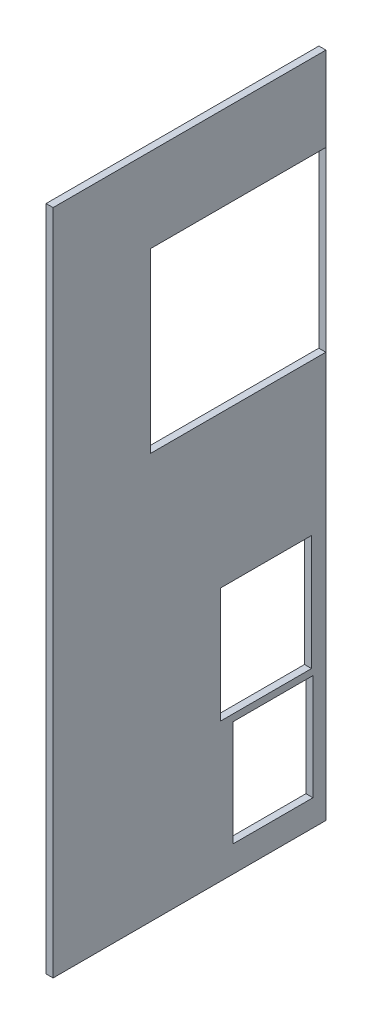
ISO-10303-21;
HEADER;
FILE_DESCRIPTION(('STEP AP214'),'2;1');
FILE_NAME('part.step','',(''),(''),'','','');
FILE_SCHEMA(('AUTOMOTIVE_DESIGN { 1 0 10303 214 1 1 1 1 }'));
ENDSEC;
DATA;
#1=APPLICATION_CONTEXT('core data for automotive mechanical design processes');
#2=APPLICATION_PROTOCOL_DEFINITION('international standard','automotive_design',2000,#1);
#3=PRODUCT_CONTEXT('',#1,'mechanical');
#4=PRODUCT('Part','Part','',(#3));
#5=PRODUCT_RELATED_PRODUCT_CATEGORY('part','',(#4));
#6=PRODUCT_DEFINITION_FORMATION('','',#4);
#7=PRODUCT_DEFINITION_CONTEXT('part definition',#1,'design');
#8=PRODUCT_DEFINITION('design','',#6,#7);
#9=PRODUCT_DEFINITION_SHAPE('','',#8);
#10=(LENGTH_UNIT() NAMED_UNIT(*) SI_UNIT(.MILLI.,.METRE.));
#11=(NAMED_UNIT(*) PLANE_ANGLE_UNIT() SI_UNIT($,.RADIAN.));
#12=(NAMED_UNIT(*) SI_UNIT($,.STERADIAN.) SOLID_ANGLE_UNIT());
#13=UNCERTAINTY_MEASURE_WITH_UNIT(LENGTH_MEASURE(1.E-05),#10,'distance_accuracy_value','');
#14=(GEOMETRIC_REPRESENTATION_CONTEXT(3) GLOBAL_UNCERTAINTY_ASSIGNED_CONTEXT((#13)) GLOBAL_UNIT_ASSIGNED_CONTEXT((#10,
#11,#12)) REPRESENTATION_CONTEXT('',''));
#15=CARTESIAN_POINT('',(0.,0.,0.));
#16=DIRECTION('',(0.,0.,1.));
#17=DIRECTION('',(1.,0.,0.));
#18=AXIS2_PLACEMENT_3D('',#15,#16,#17);
#19=CARTESIAN_POINT('',(1.5,5.85000000000011,3.40000000000003));
#20=DIRECTION('',(0.,-1.,0.));
#21=DIRECTION('',(0.,0.,-1.));
#22=AXIS2_PLACEMENT_3D('',#19,#20,#21);
#23=PLANE('',#22);
#24=DIRECTION('',(0.,0.,1.));
#25=VECTOR('',#24,1.);
#26=CARTESIAN_POINT('',(0.5,5.85000000000011,3.40000000000003));
#27=LINE('',#26,#25);
#28=CARTESIAN_POINT('',(0.5,5.85000000000011,3.40000000000003));
#29=VERTEX_POINT('',#28);
#30=CARTESIAN_POINT('',(0.5,5.85000000000012,42.25));
#31=VERTEX_POINT('',#30);
#32=EDGE_CURVE('E247',#29,#31,#27,.T.);
#33=ORIENTED_EDGE('',*,*,#32,.F.);
#34=DIRECTION('',(-1.,0.,0.));
#35=VECTOR('',#34,1.);
#36=CARTESIAN_POINT('',(1.5,5.85000000000011,3.40000000000003));
#37=LINE('',#36,#35);
#38=CARTESIAN_POINT('',(1.5,5.85000000000011,3.40000000000003));
#39=VERTEX_POINT('',#38);
#40=EDGE_CURVE('E11',#39,#29,#37,.T.);
#41=ORIENTED_EDGE('',*,*,#40,.F.);
#42=DIRECTION('',(0.,0.,1.));
#43=VECTOR('',#42,1.);
#44=CARTESIAN_POINT('',(1.5,5.85000000000011,3.40000000000003));
#45=LINE('',#44,#43);
#46=CARTESIAN_POINT('',(1.5,5.85000000000012,42.25));
#47=VERTEX_POINT('',#46);
#48=EDGE_CURVE('E248',#39,#47,#45,.T.);
#49=ORIENTED_EDGE('',*,*,#48,.T.);
#50=DIRECTION('',(-1.,0.,0.));
#51=VECTOR('',#50,1.);
#52=CARTESIAN_POINT('',(1.5,5.85000000000012,42.25));
#53=LINE('',#52,#51);
#54=EDGE_CURVE('E35',#47,#31,#53,.T.);
#55=ORIENTED_EDGE('',*,*,#54,.T.);
#56=EDGE_LOOP('',(#33,#41,#49,#55));
#57=FACE_BOUND('',#56,.T.);
#58=ADVANCED_FACE('F32',(#57),#23,.T.);
#59=CARTESIAN_POINT('',(1.5,100.85,3.40000000000002));
#60=DIRECTION('',(0.,0.,-1.));
#61=DIRECTION('',(0.,1.,0.));
#62=AXIS2_PLACEMENT_3D('',#59,#60,#61);
#63=PLANE('',#62);
#64=DIRECTION('',(0.,-1.,0.));
#65=VECTOR('',#64,1.);
#66=CARTESIAN_POINT('',(0.5,100.85,3.40000000000002));
#67=LINE('',#66,#65);
#68=CARTESIAN_POINT('',(0.5,100.85,3.40000000000002));
#69=VERTEX_POINT('',#68);
#70=EDGE_CURVE('E252',#69,#29,#67,.T.);
#71=ORIENTED_EDGE('',*,*,#70,.F.);
#72=DIRECTION('',(-1.,0.,0.));
#73=VECTOR('',#72,1.);
#74=CARTESIAN_POINT('',(1.5,100.85,3.40000000000002));
#75=LINE('',#74,#73);
#76=CARTESIAN_POINT('',(1.5,100.85,3.40000000000002));
#77=VERTEX_POINT('',#76);
#78=EDGE_CURVE('E40',#77,#69,#75,.T.);
#79=ORIENTED_EDGE('',*,*,#78,.F.);
#80=DIRECTION('',(0.,-1.,0.));
#81=VECTOR('',#80,1.);
#82=CARTESIAN_POINT('',(1.5,100.85,3.40000000000002));
#83=LINE('',#82,#81);
#84=EDGE_CURVE('E258',#77,#39,#83,.T.);
#85=ORIENTED_EDGE('',*,*,#84,.T.);
#86=ORIENTED_EDGE('',*,*,#40,.T.);
#87=EDGE_LOOP('',(#71,#79,#85,#86));
#88=FACE_BOUND('',#87,.T.);
#89=ADVANCED_FACE('F283',(#88),#63,.T.);
#90=CARTESIAN_POINT('',(1.5,100.85,42.25));
#91=DIRECTION('',(0.,1.,0.));
#92=DIRECTION('',(0.,0.,1.));
#93=AXIS2_PLACEMENT_3D('',#90,#91,#92);
#94=PLANE('',#93);
#95=DIRECTION('',(0.,0.,-1.));
#96=VECTOR('',#95,1.);
#97=CARTESIAN_POINT('',(0.5,100.85,42.25));
#98=LINE('',#97,#96);
#99=CARTESIAN_POINT('',(0.5,100.85,42.25));
#100=VERTEX_POINT('',#99);
#101=EDGE_CURVE('E266',#100,#69,#98,.T.);
#102=ORIENTED_EDGE('',*,*,#101,.F.);
#103=DIRECTION('',(-1.,0.,0.));
#104=VECTOR('',#103,1.);
#105=CARTESIAN_POINT('',(1.5,100.85,42.25));
#106=LINE('',#105,#104);
#107=CARTESIAN_POINT('',(1.5,100.85,42.25));
#108=VERTEX_POINT('',#107);
#109=EDGE_CURVE('E271',#108,#100,#106,.T.);
#110=ORIENTED_EDGE('',*,*,#109,.F.);
#111=DIRECTION('',(0.,0.,-1.));
#112=VECTOR('',#111,1.);
#113=CARTESIAN_POINT('',(1.5,100.85,42.25));
#114=LINE('',#113,#112);
#115=EDGE_CURVE('E255',#108,#77,#114,.T.);
#116=ORIENTED_EDGE('',*,*,#115,.T.);
#117=ORIENTED_EDGE('',*,*,#78,.T.);
#118=EDGE_LOOP('',(#102,#110,#116,#117));
#119=FACE_BOUND('',#118,.T.);
#120=ADVANCED_FACE('F289',(#119),#94,.T.);
#121=CARTESIAN_POINT('',(1.5,5.85000000000012,42.25));
#122=DIRECTION('',(0.,0.,1.));
#123=DIRECTION('',(0.,-1.,0.));
#124=AXIS2_PLACEMENT_3D('',#121,#122,#123);
#125=PLANE('',#124);
#126=DIRECTION('',(0.,1.,0.));
#127=VECTOR('',#126,1.);
#128=CARTESIAN_POINT('',(0.5,5.85000000000012,42.25));
#129=LINE('',#128,#127);
#130=EDGE_CURVE('E263',#31,#100,#129,.T.);
#131=ORIENTED_EDGE('',*,*,#130,.F.);
#132=ORIENTED_EDGE('',*,*,#54,.F.);
#133=DIRECTION('',(0.,1.,0.));
#134=VECTOR('',#133,1.);
#135=CARTESIAN_POINT('',(1.5,5.85000000000012,42.25));
#136=LINE('',#135,#134);
#137=EDGE_CURVE('E251',#47,#108,#136,.T.);
#138=ORIENTED_EDGE('',*,*,#137,.T.);
#139=ORIENTED_EDGE('',*,*,#109,.T.);
#140=EDGE_LOOP('',(#131,#132,#138,#139));
#141=FACE_BOUND('',#140,.T.);
#142=ADVANCED_FACE('F279',(#141),#125,.T.);
#143=CARTESIAN_POINT('',(1.5,0.,0.));
#144=DIRECTION('',(-1.,0.,0.));
#145=DIRECTION('',(0.,0.,1.));
#146=AXIS2_PLACEMENT_3D('',#143,#144,#145);
#147=PLANE('',#146);
#148=DIRECTION('',(0.,0.,-1.));
#149=VECTOR('',#148,1.);
#150=CARTESIAN_POINT('',(1.5,24.638135831115,0.));
#151=LINE('',#150,#149);
#152=CARTESIAN_POINT('',(1.5,24.638135831115,16.65));
#153=VERTEX_POINT('',#152);
#154=CARTESIAN_POINT('',(1.5,24.638135831115,5.25000000000004));
#155=VERTEX_POINT('',#154);
#156=EDGE_CURVE('E241',#153,#155,#151,.T.);
#157=ORIENTED_EDGE('',*,*,#156,.T.);
#158=DIRECTION('',(0.,-1.,0.));
#159=VECTOR('',#158,1.);
#160=CARTESIAN_POINT('',(1.5,0.,5.25000000000004));
#161=LINE('',#160,#159);
#162=CARTESIAN_POINT('',(1.5,9.57813583111501,5.25000000000004));
#163=VERTEX_POINT('',#162);
#164=EDGE_CURVE('E244',#155,#163,#161,.T.);
#165=ORIENTED_EDGE('',*,*,#164,.T.);
#166=DIRECTION('',(0.,0.,1.));
#167=VECTOR('',#166,1.);
#168=CARTESIAN_POINT('',(1.5,9.57813583111501,0.));
#169=LINE('',#168,#167);
#170=CARTESIAN_POINT('',(1.5,9.57813583111501,16.65));
#171=VERTEX_POINT('',#170);
#172=EDGE_CURVE('E238',#163,#171,#169,.T.);
#173=ORIENTED_EDGE('',*,*,#172,.T.);
#174=DIRECTION('',(0.,1.,0.));
#175=VECTOR('',#174,1.);
#176=CARTESIAN_POINT('',(1.5,0.,16.65));
#177=LINE('',#176,#175);
#178=EDGE_CURVE('E150',#171,#153,#177,.T.);
#179=ORIENTED_EDGE('',*,*,#178,.T.);
#180=EDGE_LOOP('',(#157,#165,#173,#179));
#181=FACE_BOUND('',#180,.T.);
#182=DIRECTION('',(0.,0.,-1.));
#183=VECTOR('',#182,1.);
#184=CARTESIAN_POINT('',(1.5,88.85,0.));
#185=LINE('',#184,#183);
#186=CARTESIAN_POINT('',(1.5,88.85,28.4));
#187=VERTEX_POINT('',#186);
#188=CARTESIAN_POINT('',(1.5,88.85,3.41328504716969));
#189=VERTEX_POINT('',#188);
#190=EDGE_CURVE('E232',#187,#189,#185,.T.);
#191=ORIENTED_EDGE('',*,*,#190,.T.);
#192=DIRECTION('',(0.,-1.,0.));
#193=VECTOR('',#192,1.);
#194=CARTESIAN_POINT('',(1.5,0.,3.41328504716969));
#195=LINE('',#194,#193);
#196=CARTESIAN_POINT('',(1.5,63.6,3.41328504716969));
#197=VERTEX_POINT('',#196);
#198=EDGE_CURVE('E235',#189,#197,#195,.T.);
#199=ORIENTED_EDGE('',*,*,#198,.T.);
#200=DIRECTION('',(0.,0.,1.));
#201=VECTOR('',#200,1.);
#202=CARTESIAN_POINT('',(1.5,63.6,0.));
#203=LINE('',#202,#201);
#204=CARTESIAN_POINT('',(1.5,63.6,28.4));
#205=VERTEX_POINT('',#204);
#206=EDGE_CURVE('E226',#197,#205,#203,.T.);
#207=ORIENTED_EDGE('',*,*,#206,.T.);
#208=DIRECTION('',(0.,1.,0.));
#209=VECTOR('',#208,1.);
#210=CARTESIAN_POINT('',(1.5,0.,28.4));
#211=LINE('',#210,#209);
#212=EDGE_CURVE('E229',#205,#187,#211,.T.);
#213=ORIENTED_EDGE('',*,*,#212,.T.);
#214=EDGE_LOOP('',(#191,#199,#207,#213));
#215=FACE_BOUND('',#214,.T.);
#216=DIRECTION('',(0.,0.,-1.));
#217=VECTOR('',#216,1.);
#218=CARTESIAN_POINT('',(1.5,42.0175613536461,0.));
#219=LINE('',#218,#217);
#220=CARTESIAN_POINT('',(1.5,42.0175613536461,18.4326));
#221=VERTEX_POINT('',#220);
#222=CARTESIAN_POINT('',(1.5,42.0175613536461,5.4557399975515));
#223=VERTEX_POINT('',#222);
#224=EDGE_CURVE('E220',#221,#223,#219,.T.);
#225=ORIENTED_EDGE('',*,*,#224,.T.);
#226=DIRECTION('',(0.,-1.,0.));
#227=VECTOR('',#226,1.);
#228=CARTESIAN_POINT('',(1.5,0.,5.4557399975515));
#229=LINE('',#228,#227);
#230=CARTESIAN_POINT('',(1.5,25.6091613536461,5.4557399975515));
#231=VERTEX_POINT('',#230);
#232=EDGE_CURVE('E223',#223,#231,#229,.T.);
#233=ORIENTED_EDGE('',*,*,#232,.T.);
#234=DIRECTION('',(0.,0.,1.));
#235=VECTOR('',#234,1.);
#236=CARTESIAN_POINT('',(1.5,25.6091613536461,0.));
#237=LINE('',#236,#235);
#238=CARTESIAN_POINT('',(1.5,25.6091613536461,18.4326));
#239=VERTEX_POINT('',#238);
#240=EDGE_CURVE('E174',#231,#239,#237,.T.);
#241=ORIENTED_EDGE('',*,*,#240,.T.);
#242=DIRECTION('',(0.,1.,0.));
#243=VECTOR('',#242,1.);
#244=CARTESIAN_POINT('',(1.5,0.,18.4326));
#245=LINE('',#244,#243);
#246=EDGE_CURVE('E217',#239,#221,#245,.T.);
#247=ORIENTED_EDGE('',*,*,#246,.T.);
#248=EDGE_LOOP('',(#225,#233,#241,#247));
#249=FACE_BOUND('',#248,.T.);
#250=ORIENTED_EDGE('',*,*,#48,.F.);
#251=ORIENTED_EDGE('',*,*,#84,.F.);
#252=ORIENTED_EDGE('',*,*,#115,.F.);
#253=ORIENTED_EDGE('',*,*,#137,.F.);
#254=EDGE_LOOP('',(#250,#251,#252,#253));
#255=FACE_BOUND('',#254,.T.);
#256=ADVANCED_FACE('F286',(#181,#215,#249,#255),#147,.F.);
#257=CARTESIAN_POINT('',(0.5,0.,0.));
#258=DIRECTION('',(-1.,0.,0.));
#259=DIRECTION('',(0.,0.,1.));
#260=AXIS2_PLACEMENT_3D('',#257,#258,#259);
#261=PLANE('',#260);
#262=DIRECTION('',(0.,-1.,0.));
#263=VECTOR('',#262,1.);
#264=CARTESIAN_POINT('',(0.5,9.57813583111501,5.25000000000004));
#265=LINE('',#264,#263);
#266=CARTESIAN_POINT('',(0.5,24.638135831115,5.25000000000004));
#267=VERTEX_POINT('',#266);
#268=CARTESIAN_POINT('',(0.5,9.57813583111501,5.25000000000004));
#269=VERTEX_POINT('',#268);
#270=EDGE_CURVE('E162',#267,#269,#265,.T.);
#271=ORIENTED_EDGE('',*,*,#270,.F.);
#272=DIRECTION('',(0.,0.,-1.));
#273=VECTOR('',#272,1.);
#274=CARTESIAN_POINT('',(0.5,24.638135831115,5.25000000000004));
#275=LINE('',#274,#273);
#276=CARTESIAN_POINT('',(0.5,24.638135831115,16.65));
#277=VERTEX_POINT('',#276);
#278=EDGE_CURVE('E167',#277,#267,#275,.T.);
#279=ORIENTED_EDGE('',*,*,#278,.F.);
#280=DIRECTION('',(0.,1.,0.));
#281=VECTOR('',#280,1.);
#282=CARTESIAN_POINT('',(0.5,9.57813583111501,16.65));
#283=LINE('',#282,#281);
#284=CARTESIAN_POINT('',(0.5,9.57813583111501,16.65));
#285=VERTEX_POINT('',#284);
#286=EDGE_CURVE('E147',#285,#277,#283,.T.);
#287=ORIENTED_EDGE('',*,*,#286,.F.);
#288=DIRECTION('',(0.,0.,1.));
#289=VECTOR('',#288,1.);
#290=CARTESIAN_POINT('',(0.5,9.57813583111501,5.25000000000004));
#291=LINE('',#290,#289);
#292=EDGE_CURVE('E157',#269,#285,#291,.T.);
#293=ORIENTED_EDGE('',*,*,#292,.F.);
#294=EDGE_LOOP('',(#271,#279,#287,#293));
#295=FACE_BOUND('',#294,.T.);
#296=DIRECTION('',(0.,-1.,0.));
#297=VECTOR('',#296,1.);
#298=CARTESIAN_POINT('',(0.5,63.6,3.41328504716969));
#299=LINE('',#298,#297);
#300=CARTESIAN_POINT('',(0.5,88.85,3.41328504716969));
#301=VERTEX_POINT('',#300);
#302=CARTESIAN_POINT('',(0.5,63.6,3.41328504716969));
#303=VERTEX_POINT('',#302);
#304=EDGE_CURVE('E177',#301,#303,#299,.T.);
#305=ORIENTED_EDGE('',*,*,#304,.F.);
#306=DIRECTION('',(0.,0.,-1.));
#307=VECTOR('',#306,1.);
#308=CARTESIAN_POINT('',(0.5,88.85,3.41328504716969));
#309=LINE('',#308,#307);
#310=CARTESIAN_POINT('',(0.5,88.85,28.4));
#311=VERTEX_POINT('',#310);
#312=EDGE_CURVE('E185',#311,#301,#309,.T.);
#313=ORIENTED_EDGE('',*,*,#312,.F.);
#314=DIRECTION('',(0.,1.,0.));
#315=VECTOR('',#314,1.);
#316=CARTESIAN_POINT('',(0.5,63.6,28.4));
#317=LINE('',#316,#315);
#318=CARTESIAN_POINT('',(0.5,63.6,28.4));
#319=VERTEX_POINT('',#318);
#320=EDGE_CURVE('E182',#319,#311,#317,.T.);
#321=ORIENTED_EDGE('',*,*,#320,.F.);
#322=DIRECTION('',(0.,0.,1.));
#323=VECTOR('',#322,1.);
#324=CARTESIAN_POINT('',(0.5,63.6,3.41328504716969));
#325=LINE('',#324,#323);
#326=EDGE_CURVE('E179',#303,#319,#325,.T.);
#327=ORIENTED_EDGE('',*,*,#326,.F.);
#328=EDGE_LOOP('',(#305,#313,#321,#327));
#329=FACE_BOUND('',#328,.T.);
#330=DIRECTION('',(0.,-1.,0.));
#331=VECTOR('',#330,1.);
#332=CARTESIAN_POINT('',(0.5,42.0175613536461,5.4557399975515));
#333=LINE('',#332,#331);
#334=CARTESIAN_POINT('',(0.5,42.0175613536461,5.4557399975515));
#335=VERTEX_POINT('',#334);
#336=CARTESIAN_POINT('',(0.5,25.6091613536461,5.4557399975515));
#337=VERTEX_POINT('',#336);
#338=EDGE_CURVE('E196',#335,#337,#333,.T.);
#339=ORIENTED_EDGE('',*,*,#338,.F.);
#340=DIRECTION('',(0.,0.,-1.));
#341=VECTOR('',#340,1.);
#342=CARTESIAN_POINT('',(0.5,42.0175613536461,5.4557399975515));
#343=LINE('',#342,#341);
#344=CARTESIAN_POINT('',(0.5,42.0175613536461,18.4326));
#345=VERTEX_POINT('',#344);
#346=EDGE_CURVE('E204',#345,#335,#343,.T.);
#347=ORIENTED_EDGE('',*,*,#346,.F.);
#348=DIRECTION('',(0.,1.,0.));
#349=VECTOR('',#348,1.);
#350=CARTESIAN_POINT('',(0.5,42.0175613536461,18.4326));
#351=LINE('',#350,#349);
#352=CARTESIAN_POINT('',(0.5,25.6091613536461,18.4326));
#353=VERTEX_POINT('',#352);
#354=EDGE_CURVE('E201',#353,#345,#351,.T.);
#355=ORIENTED_EDGE('',*,*,#354,.F.);
#356=DIRECTION('',(0.,0.,1.));
#357=VECTOR('',#356,1.);
#358=CARTESIAN_POINT('',(0.5,25.6091613536461,5.4557399975515));
#359=LINE('',#358,#357);
#360=EDGE_CURVE('E198',#337,#353,#359,.T.);
#361=ORIENTED_EDGE('',*,*,#360,.F.);
#362=EDGE_LOOP('',(#339,#347,#355,#361));
#363=FACE_BOUND('',#362,.T.);
#364=ORIENTED_EDGE('',*,*,#32,.T.);
#365=ORIENTED_EDGE('',*,*,#130,.T.);
#366=ORIENTED_EDGE('',*,*,#101,.T.);
#367=ORIENTED_EDGE('',*,*,#70,.T.);
#368=EDGE_LOOP('',(#364,#365,#366,#367));
#369=FACE_BOUND('',#368,.T.);
#370=ADVANCED_FACE('F164',(#295,#329,#363,#369),#261,.T.);
#371=CARTESIAN_POINT('',(10.5,42.0175613536461,5.4557399975515));
#372=DIRECTION('',(0.,0.,-1.));
#373=DIRECTION('',(-1.,0.,0.));
#374=AXIS2_PLACEMENT_3D('',#371,#372,#373);
#375=PLANE('',#374);
#376=DIRECTION('',(-1.,0.,0.));
#377=VECTOR('',#376,1.);
#378=CARTESIAN_POINT('',(10.5,42.0175613536461,5.4557399975515));
#379=LINE('',#378,#377);
#380=EDGE_CURVE('E180',#223,#335,#379,.T.);
#381=ORIENTED_EDGE('',*,*,#380,.T.);
#382=ORIENTED_EDGE('',*,*,#338,.T.);
#383=DIRECTION('',(-1.,0.,0.));
#384=VECTOR('',#383,1.);
#385=CARTESIAN_POINT('',(10.5,25.6091613536461,5.4557399975515));
#386=LINE('',#385,#384);
#387=EDGE_CURVE('E207',#231,#337,#386,.T.);
#388=ORIENTED_EDGE('',*,*,#387,.F.);
#389=ORIENTED_EDGE('',*,*,#232,.F.);
#390=EDGE_LOOP('',(#381,#382,#388,#389));
#391=FACE_BOUND('',#390,.T.);
#392=ADVANCED_FACE('F332',(#391),#375,.F.);
#393=CARTESIAN_POINT('',(10.5,42.0175613536461,5.4557399975515));
#394=DIRECTION('',(0.,1.,0.));
#395=DIRECTION('',(0.,0.,1.));
#396=AXIS2_PLACEMENT_3D('',#393,#394,#395);
#397=PLANE('',#396);
#398=DIRECTION('',(-1.,0.,0.));
#399=VECTOR('',#398,1.);
#400=CARTESIAN_POINT('',(10.5,42.0175613536461,18.4326));
#401=LINE('',#400,#399);
#402=EDGE_CURVE('E209',#221,#345,#401,.T.);
#403=ORIENTED_EDGE('',*,*,#402,.T.);
#404=ORIENTED_EDGE('',*,*,#346,.T.);
#405=ORIENTED_EDGE('',*,*,#380,.F.);
#406=ORIENTED_EDGE('',*,*,#224,.F.);
#407=EDGE_LOOP('',(#403,#404,#405,#406));
#408=FACE_BOUND('',#407,.T.);
#409=ADVANCED_FACE('F341',(#408),#397,.F.);
#410=CARTESIAN_POINT('',(10.5,42.0175613536461,18.4326));
#411=DIRECTION('',(0.,0.,1.));
#412=DIRECTION('',(1.,0.,0.));
#413=AXIS2_PLACEMENT_3D('',#410,#411,#412);
#414=PLANE('',#413);
#415=DIRECTION('',(-1.,0.,0.));
#416=VECTOR('',#415,1.);
#417=CARTESIAN_POINT('',(10.5,25.6091613536461,18.4326));
#418=LINE('',#417,#416);
#419=EDGE_CURVE('E211',#239,#353,#418,.T.);
#420=ORIENTED_EDGE('',*,*,#419,.T.);
#421=ORIENTED_EDGE('',*,*,#354,.T.);
#422=ORIENTED_EDGE('',*,*,#402,.F.);
#423=ORIENTED_EDGE('',*,*,#246,.F.);
#424=EDGE_LOOP('',(#420,#421,#422,#423));
#425=FACE_BOUND('',#424,.T.);
#426=ADVANCED_FACE('F351',(#425),#414,.F.);
#427=CARTESIAN_POINT('',(10.5,25.6091613536461,5.4557399975515));
#428=DIRECTION('',(0.,-1.,0.));
#429=DIRECTION('',(0.,0.,-1.));
#430=AXIS2_PLACEMENT_3D('',#427,#428,#429);
#431=PLANE('',#430);
#432=ORIENTED_EDGE('',*,*,#387,.T.);
#433=ORIENTED_EDGE('',*,*,#360,.T.);
#434=ORIENTED_EDGE('',*,*,#419,.F.);
#435=ORIENTED_EDGE('',*,*,#240,.F.);
#436=EDGE_LOOP('',(#432,#433,#434,#435));
#437=FACE_BOUND('',#436,.T.);
#438=ADVANCED_FACE('F361',(#437),#431,.F.);
#439=CARTESIAN_POINT('',(10.5,63.6,3.41328504716969));
#440=DIRECTION('',(0.,0.,-1.));
#441=DIRECTION('',(-1.,0.,0.));
#442=AXIS2_PLACEMENT_3D('',#439,#440,#441);
#443=PLANE('',#442);
#444=DIRECTION('',(-1.,0.,0.));
#445=VECTOR('',#444,1.);
#446=CARTESIAN_POINT('',(10.5,88.85,3.41328504716969));
#447=LINE('',#446,#445);
#448=EDGE_CURVE('E189',#189,#301,#447,.T.);
#449=ORIENTED_EDGE('',*,*,#448,.T.);
#450=ORIENTED_EDGE('',*,*,#304,.T.);
#451=DIRECTION('',(-1.,0.,0.));
#452=VECTOR('',#451,1.);
#453=CARTESIAN_POINT('',(10.5,63.6,3.41328504716969));
#454=LINE('',#453,#452);
#455=EDGE_CURVE('E188',#197,#303,#454,.T.);
#456=ORIENTED_EDGE('',*,*,#455,.F.);
#457=ORIENTED_EDGE('',*,*,#198,.F.);
#458=EDGE_LOOP('',(#449,#450,#456,#457));
#459=FACE_BOUND('',#458,.T.);
#460=ADVANCED_FACE('F371',(#459),#443,.F.);
#461=CARTESIAN_POINT('',(10.5,88.85,3.41328504716969));
#462=DIRECTION('',(0.,1.,0.));
#463=DIRECTION('',(0.,0.,1.));
#464=AXIS2_PLACEMENT_3D('',#461,#462,#463);
#465=PLANE('',#464);
#466=DIRECTION('',(-1.,0.,0.));
#467=VECTOR('',#466,1.);
#468=CARTESIAN_POINT('',(10.5,88.85,28.4));
#469=LINE('',#468,#467);
#470=EDGE_CURVE('E191',#187,#311,#469,.T.);
#471=ORIENTED_EDGE('',*,*,#470,.T.);
#472=ORIENTED_EDGE('',*,*,#312,.T.);
#473=ORIENTED_EDGE('',*,*,#448,.F.);
#474=ORIENTED_EDGE('',*,*,#190,.F.);
#475=EDGE_LOOP('',(#471,#472,#473,#474));
#476=FACE_BOUND('',#475,.T.);
#477=ADVANCED_FACE('F381',(#476),#465,.F.);
#478=CARTESIAN_POINT('',(10.5,63.6,28.4));
#479=DIRECTION('',(0.,0.,1.));
#480=DIRECTION('',(1.,0.,0.));
#481=AXIS2_PLACEMENT_3D('',#478,#479,#480);
#482=PLANE('',#481);
#483=DIRECTION('',(-1.,0.,0.));
#484=VECTOR('',#483,1.);
#485=CARTESIAN_POINT('',(10.5,63.6,28.4));
#486=LINE('',#485,#484);
#487=EDGE_CURVE('E56',#205,#319,#486,.T.);
#488=ORIENTED_EDGE('',*,*,#487,.T.);
#489=ORIENTED_EDGE('',*,*,#320,.T.);
#490=ORIENTED_EDGE('',*,*,#470,.F.);
#491=ORIENTED_EDGE('',*,*,#212,.F.);
#492=EDGE_LOOP('',(#488,#489,#490,#491));
#493=FACE_BOUND('',#492,.T.);
#494=ADVANCED_FACE('F391',(#493),#482,.F.);
#495=CARTESIAN_POINT('',(10.5,63.6,3.41328504716969));
#496=DIRECTION('',(0.,-1.,0.));
#497=DIRECTION('',(0.,0.,-1.));
#498=AXIS2_PLACEMENT_3D('',#495,#496,#497);
#499=PLANE('',#498);
#500=ORIENTED_EDGE('',*,*,#455,.T.);
#501=ORIENTED_EDGE('',*,*,#326,.T.);
#502=ORIENTED_EDGE('',*,*,#487,.F.);
#503=ORIENTED_EDGE('',*,*,#206,.F.);
#504=EDGE_LOOP('',(#500,#501,#502,#503));
#505=FACE_BOUND('',#504,.T.);
#506=ADVANCED_FACE('F401',(#505),#499,.F.);
#507=CARTESIAN_POINT('',(10.5,9.57813583111501,5.25000000000004));
#508=DIRECTION('',(0.,0.,-1.));
#509=DIRECTION('',(-1.,0.,0.));
#510=AXIS2_PLACEMENT_3D('',#507,#508,#509);
#511=PLANE('',#510);
#512=DIRECTION('',(-1.,0.,0.));
#513=VECTOR('',#512,1.);
#514=CARTESIAN_POINT('',(10.5,24.638135831115,5.25000000000004));
#515=LINE('',#514,#513);
#516=EDGE_CURVE('E172',#155,#267,#515,.T.);
#517=ORIENTED_EDGE('',*,*,#516,.T.);
#518=ORIENTED_EDGE('',*,*,#270,.T.);
#519=DIRECTION('',(-1.,0.,0.));
#520=VECTOR('',#519,1.);
#521=CARTESIAN_POINT('',(10.5,9.57813583111501,5.25000000000004));
#522=LINE('',#521,#520);
#523=EDGE_CURVE('E153',#163,#269,#522,.T.);
#524=ORIENTED_EDGE('',*,*,#523,.F.);
#525=ORIENTED_EDGE('',*,*,#164,.F.);
#526=EDGE_LOOP('',(#517,#518,#524,#525));
#527=FACE_BOUND('',#526,.T.);
#528=ADVANCED_FACE('F411',(#527),#511,.F.);
#529=CARTESIAN_POINT('',(10.5,24.638135831115,5.25000000000004));
#530=DIRECTION('',(0.,1.,0.));
#531=DIRECTION('',(0.,0.,1.));
#532=AXIS2_PLACEMENT_3D('',#529,#530,#531);
#533=PLANE('',#532);
#534=DIRECTION('',(-1.,0.,0.));
#535=VECTOR('',#534,1.);
#536=CARTESIAN_POINT('',(10.5,24.638135831115,16.65));
#537=LINE('',#536,#535);
#538=EDGE_CURVE('E152',#153,#277,#537,.T.);
#539=ORIENTED_EDGE('',*,*,#538,.T.);
#540=ORIENTED_EDGE('',*,*,#278,.T.);
#541=ORIENTED_EDGE('',*,*,#516,.F.);
#542=ORIENTED_EDGE('',*,*,#156,.F.);
#543=EDGE_LOOP('',(#539,#540,#541,#542));
#544=FACE_BOUND('',#543,.T.);
#545=ADVANCED_FACE('F420',(#544),#533,.F.);
#546=CARTESIAN_POINT('',(10.5,9.57813583111501,16.65));
#547=DIRECTION('',(0.,0.,1.));
#548=DIRECTION('',(1.,0.,0.));
#549=AXIS2_PLACEMENT_3D('',#546,#547,#548);
#550=PLANE('',#549);
#551=DIRECTION('',(-1.,0.,0.));
#552=VECTOR('',#551,1.);
#553=CARTESIAN_POINT('',(10.5,9.57813583111501,16.65));
#554=LINE('',#553,#552);
#555=EDGE_CURVE('E48',#171,#285,#554,.T.);
#556=ORIENTED_EDGE('',*,*,#555,.T.);
#557=ORIENTED_EDGE('',*,*,#286,.T.);
#558=ORIENTED_EDGE('',*,*,#538,.F.);
#559=ORIENTED_EDGE('',*,*,#178,.F.);
#560=EDGE_LOOP('',(#556,#557,#558,#559));
#561=FACE_BOUND('',#560,.T.);
#562=ADVANCED_FACE('F144',(#561),#550,.F.);
#563=CARTESIAN_POINT('',(10.5,9.57813583111501,5.25000000000004));
#564=DIRECTION('',(0.,-1.,0.));
#565=DIRECTION('',(0.,0.,-1.));
#566=AXIS2_PLACEMENT_3D('',#563,#564,#565);
#567=PLANE('',#566);
#568=ORIENTED_EDGE('',*,*,#523,.T.);
#569=ORIENTED_EDGE('',*,*,#292,.T.);
#570=ORIENTED_EDGE('',*,*,#555,.F.);
#571=ORIENTED_EDGE('',*,*,#172,.F.);
#572=EDGE_LOOP('',(#568,#569,#570,#571));
#573=FACE_BOUND('',#572,.T.);
#574=ADVANCED_FACE('F158',(#573),#567,.F.);
#575=CLOSED_SHELL('',(#58,#89,#120,#142,#256,#370,#392,#409,#426,#438,#460,#477,#494,#506,#528,
#545,#562,#574));
#576=MANIFOLD_SOLID_BREP('B2',#575);
#577=ADVANCED_BREP_SHAPE_REPRESENTATION('',(#18,#576),#14);
#578=SHAPE_DEFINITION_REPRESENTATION(#9,#577);
ENDSEC;
END-ISO-10303-21;
